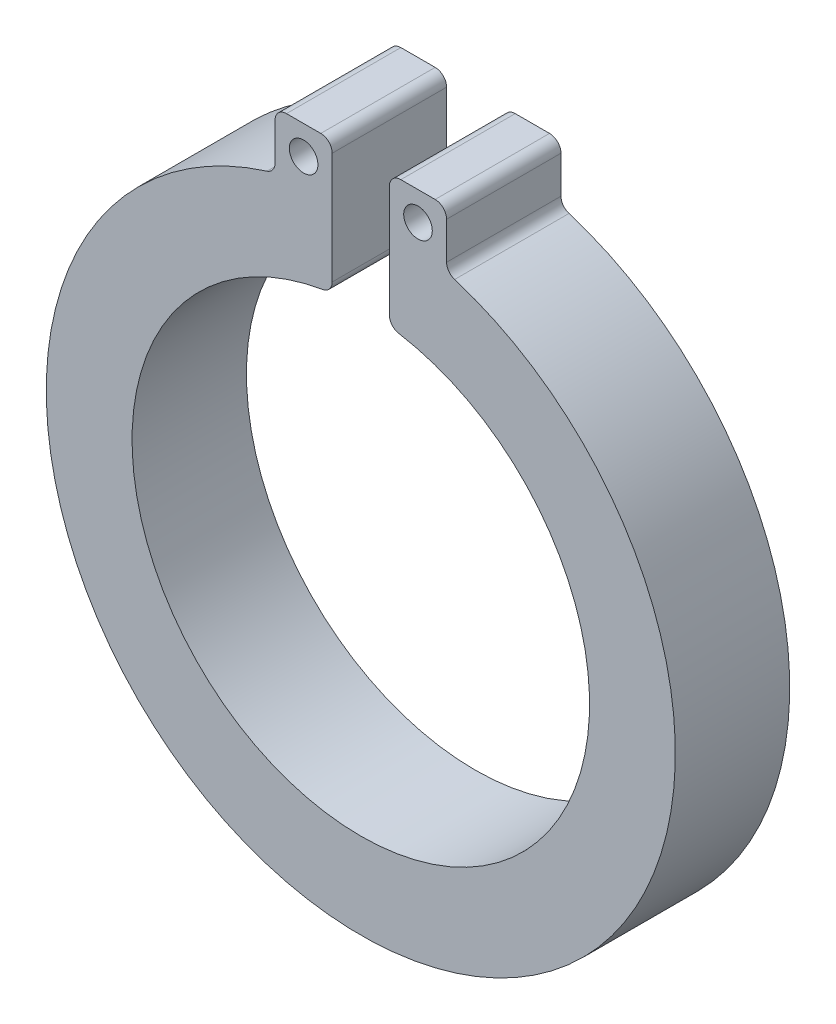
ISO-10303-21;
HEADER;
FILE_DESCRIPTION(('STEP AP214'),'2;1');
FILE_NAME('part.step','',(''),(''),'','','');
FILE_SCHEMA(('AUTOMOTIVE_DESIGN { 1 0 10303 214 1 1 1 1 }'));
ENDSEC;
DATA;
#1=APPLICATION_CONTEXT('core data for automotive mechanical design processes');
#2=APPLICATION_PROTOCOL_DEFINITION('international standard','automotive_design',2000,#1);
#3=PRODUCT_CONTEXT('',#1,'mechanical');
#4=PRODUCT('Part','Part','',(#3));
#5=PRODUCT_RELATED_PRODUCT_CATEGORY('part','',(#4));
#6=PRODUCT_DEFINITION_FORMATION('','',#4);
#7=PRODUCT_DEFINITION_CONTEXT('part definition',#1,'design');
#8=PRODUCT_DEFINITION('design','',#6,#7);
#9=PRODUCT_DEFINITION_SHAPE('','',#8);
#10=(LENGTH_UNIT() NAMED_UNIT(*) SI_UNIT(.MILLI.,.METRE.));
#11=(NAMED_UNIT(*) PLANE_ANGLE_UNIT() SI_UNIT($,.RADIAN.));
#12=(NAMED_UNIT(*) SI_UNIT($,.STERADIAN.) SOLID_ANGLE_UNIT());
#13=UNCERTAINTY_MEASURE_WITH_UNIT(LENGTH_MEASURE(1.E-05),#10,'distance_accuracy_value','');
#14=(GEOMETRIC_REPRESENTATION_CONTEXT(3) GLOBAL_UNCERTAINTY_ASSIGNED_CONTEXT((#13)) GLOBAL_UNIT_ASSIGNED_CONTEXT((#10,
#11,#12)) REPRESENTATION_CONTEXT('',''));
#15=CARTESIAN_POINT('',(0.,0.,0.));
#16=DIRECTION('',(0.,0.,1.));
#17=DIRECTION('',(1.,0.,0.));
#18=AXIS2_PLACEMENT_3D('',#15,#16,#17);
#19=CARTESIAN_POINT('',(0.,0.,1.));
#20=DIRECTION('',(0.,0.,1.));
#21=DIRECTION('',(1.,0.,0.));
#22=AXIS2_PLACEMENT_3D('',#19,#20,#21);
#23=PLANE('',#22);
#24=CARTESIAN_POINT('',(-0.5,2.89575131106459,1.));
#25=DIRECTION('',(0.,0.,1.));
#26=DIRECTION('',(1.,0.,0.));
#27=AXIS2_PLACEMENT_3D('',#24,#25,#26);
#28=CIRCLE('',#27,0.125);
#29=CARTESIAN_POINT('',(-0.375,2.89575131106459,1.));
#30=VERTEX_POINT('',#29);
#31=EDGE_CURVE('E186',#30,#30,#28,.T.);
#32=ORIENTED_EDGE('',*,*,#31,.F.);
#33=EDGE_LOOP('',(#32));
#34=FACE_BOUND('',#33,.T.);
#35=DIRECTION('',(-1.,0.,0.));
#36=VECTOR('',#35,1.);
#37=CARTESIAN_POINT('',(-0.25,3.14575131106459,1.));
#38=LINE('',#37,#36);
#39=CARTESIAN_POINT('',(-0.35,3.14575131106459,1.));
#40=VERTEX_POINT('',#39);
#41=CARTESIAN_POINT('',(-0.65,3.14575131106459,1.));
#42=VERTEX_POINT('',#41);
#43=EDGE_CURVE('E203',#40,#42,#38,.T.);
#44=ORIENTED_EDGE('',*,*,#43,.T.);
#45=CARTESIAN_POINT('',(-0.65,3.04575131106459,1.));
#46=DIRECTION('',(0.,0.,1.));
#47=DIRECTION('',(1.,0.,0.));
#48=AXIS2_PLACEMENT_3D('',#45,#46,#47);
#49=CIRCLE('',#48,0.1);
#50=CARTESIAN_POINT('',(-0.75,3.04575131106459,1.));
#51=VERTEX_POINT('',#50);
#52=EDGE_CURVE('E226',#42,#51,#49,.T.);
#53=ORIENTED_EDGE('',*,*,#52,.T.);
#54=DIRECTION('',(0.,-1.,0.));
#55=VECTOR('',#54,1.);
#56=CARTESIAN_POINT('',(-0.75,3.14575131106459,1.));
#57=LINE('',#56,#55);
#58=CARTESIAN_POINT('',(-0.75,2.72029410174709,1.));
#59=VERTEX_POINT('',#58);
#60=EDGE_CURVE('E173',#51,#59,#57,.T.);
#61=ORIENTED_EDGE('',*,*,#60,.T.);
#62=CARTESIAN_POINT('',(-0.85,2.72029410174709,1.));
#63=DIRECTION('',(0.,0.,1.));
#64=DIRECTION('',(1.,0.,0.));
#65=AXIS2_PLACEMENT_3D('',#62,#63,#64);
#66=CIRCLE('',#65,0.1);
#67=CARTESIAN_POINT('',(-0.820175438596491,2.62484518589631,1.));
#68=VERTEX_POINT('',#67);
#69=EDGE_CURVE('E11',#59,#68,#66,.F.);
#70=ORIENTED_EDGE('',*,*,#69,.T.);
#71=CARTESIAN_POINT('',(0.,0.,1.));
#72=DIRECTION('',(0.,0.,1.));
#73=DIRECTION('',(1.,0.,0.));
#74=AXIS2_PLACEMENT_3D('',#71,#72,#73);
#75=CIRCLE('',#74,2.75);
#76=CARTESIAN_POINT('',(0.820175438596491,2.62484518589631,1.));
#77=VERTEX_POINT('',#76);
#78=EDGE_CURVE('E269',#68,#77,#75,.T.);
#79=ORIENTED_EDGE('',*,*,#78,.T.);
#80=CARTESIAN_POINT('',(0.85,2.72029410174709,1.));
#81=DIRECTION('',(0.,0.,1.));
#82=DIRECTION('',(1.,0.,0.));
#83=AXIS2_PLACEMENT_3D('',#80,#81,#82);
#84=CIRCLE('',#83,0.1);
#85=CARTESIAN_POINT('',(0.75,2.72029410174709,1.));
#86=VERTEX_POINT('',#85);
#87=EDGE_CURVE('E259',#77,#86,#84,.F.);
#88=ORIENTED_EDGE('',*,*,#87,.T.);
#89=DIRECTION('',(0.,1.,0.));
#90=VECTOR('',#89,1.);
#91=CARTESIAN_POINT('',(0.75,3.14575131106459,1.));
#92=LINE('',#91,#90);
#93=CARTESIAN_POINT('',(0.75,3.04575131106459,1.));
#94=VERTEX_POINT('',#93);
#95=EDGE_CURVE('E266',#86,#94,#92,.T.);
#96=ORIENTED_EDGE('',*,*,#95,.T.);
#97=CARTESIAN_POINT('',(0.65,3.04575131106459,1.));
#98=DIRECTION('',(0.,0.,1.));
#99=DIRECTION('',(1.,0.,0.));
#100=AXIS2_PLACEMENT_3D('',#97,#98,#99);
#101=CIRCLE('',#100,0.1);
#102=CARTESIAN_POINT('',(0.65,3.14575131106459,1.));
#103=VERTEX_POINT('',#102);
#104=EDGE_CURVE('E220',#94,#103,#101,.T.);
#105=ORIENTED_EDGE('',*,*,#104,.T.);
#106=DIRECTION('',(-1.,0.,0.));
#107=VECTOR('',#106,1.);
#108=CARTESIAN_POINT('',(0.25,3.14575131106459,1.));
#109=LINE('',#108,#107);
#110=CARTESIAN_POINT('',(0.35,3.14575131106459,1.));
#111=VERTEX_POINT('',#110);
#112=EDGE_CURVE('E277',#103,#111,#109,.T.);
#113=ORIENTED_EDGE('',*,*,#112,.T.);
#114=CARTESIAN_POINT('',(0.35,3.04575131106459,1.));
#115=DIRECTION('',(0.,0.,1.));
#116=DIRECTION('',(1.,0.,0.));
#117=AXIS2_PLACEMENT_3D('',#114,#115,#116);
#118=CIRCLE('',#117,0.1);
#119=CARTESIAN_POINT('',(0.25,3.04575131106459,1.));
#120=VERTEX_POINT('',#119);
#121=EDGE_CURVE('E222',#111,#120,#118,.T.);
#122=ORIENTED_EDGE('',*,*,#121,.T.);
#123=DIRECTION('',(0.,-1.,0.));
#124=VECTOR('',#123,1.);
#125=CARTESIAN_POINT('',(0.25,3.14575131106459,1.));
#126=LINE('',#125,#124);
#127=CARTESIAN_POINT('',(0.25,2.07062792408487,1.));
#128=VERTEX_POINT('',#127);
#129=EDGE_CURVE('E293',#120,#128,#126,.T.);
#130=ORIENTED_EDGE('',*,*,#129,.T.);
#131=CARTESIAN_POINT('',(0.35,2.07062792408487,1.));
#132=DIRECTION('',(0.,0.,1.));
#133=DIRECTION('',(1.,0.,0.));
#134=AXIS2_PLACEMENT_3D('',#131,#132,#133);
#135=CIRCLE('',#134,0.1);
#136=CARTESIAN_POINT('',(0.333333333333333,1.97202659436654,1.));
#137=VERTEX_POINT('',#136);
#138=EDGE_CURVE('E218',#128,#137,#135,.T.);
#139=ORIENTED_EDGE('',*,*,#138,.T.);
#140=CARTESIAN_POINT('',(0.,0.,1.));
#141=DIRECTION('',(0.,0.,-1.));
#142=DIRECTION('',(1.,0.,0.));
#143=AXIS2_PLACEMENT_3D('',#140,#141,#142);
#144=CIRCLE('',#143,2.);
#145=CARTESIAN_POINT('',(-0.333333333333333,1.97202659436654,1.));
#146=VERTEX_POINT('',#145);
#147=EDGE_CURVE('E296',#137,#146,#144,.T.);
#148=ORIENTED_EDGE('',*,*,#147,.T.);
#149=CARTESIAN_POINT('',(-0.35,2.07062792408487,1.));
#150=DIRECTION('',(0.,0.,1.));
#151=DIRECTION('',(1.,0.,0.));
#152=AXIS2_PLACEMENT_3D('',#149,#150,#151);
#153=CIRCLE('',#152,0.1);
#154=CARTESIAN_POINT('',(-0.25,2.07062792408487,1.));
#155=VERTEX_POINT('',#154);
#156=EDGE_CURVE('E61',#146,#155,#153,.T.);
#157=ORIENTED_EDGE('',*,*,#156,.T.);
#158=DIRECTION('',(0.,1.,0.));
#159=VECTOR('',#158,1.);
#160=CARTESIAN_POINT('',(-0.25,3.14575131106459,1.));
#161=LINE('',#160,#159);
#162=CARTESIAN_POINT('',(-0.25,3.04575131106459,1.));
#163=VERTEX_POINT('',#162);
#164=EDGE_CURVE('E204',#155,#163,#161,.T.);
#165=ORIENTED_EDGE('',*,*,#164,.T.);
#166=CARTESIAN_POINT('',(-0.35,3.04575131106459,1.));
#167=DIRECTION('',(0.,0.,1.));
#168=DIRECTION('',(1.,0.,0.));
#169=AXIS2_PLACEMENT_3D('',#166,#167,#168);
#170=CIRCLE('',#169,0.1);
#171=EDGE_CURVE('E224',#163,#40,#170,.T.);
#172=ORIENTED_EDGE('',*,*,#171,.T.);
#173=EDGE_LOOP('',(#44,#53,#61,#70,#79,#88,#96,#105,#113,#122,#130,#139,#148,#157,#165,#172));
#174=FACE_BOUND('',#173,.T.);
#175=CARTESIAN_POINT('',(0.5,2.89575131106459,1.));
#176=DIRECTION('',(0.,0.,1.));
#177=DIRECTION('',(1.,0.,0.));
#178=AXIS2_PLACEMENT_3D('',#175,#176,#177);
#179=CIRCLE('',#178,0.125);
#180=CARTESIAN_POINT('',(0.625,2.89575131106459,1.));
#181=VERTEX_POINT('',#180);
#182=EDGE_CURVE('E503',#181,#181,#179,.T.);
#183=ORIENTED_EDGE('',*,*,#182,.F.);
#184=EDGE_LOOP('',(#183));
#185=FACE_BOUND('',#184,.T.);
#186=ADVANCED_FACE('F39',(#34,#174,#185),#23,.T.);
#187=CARTESIAN_POINT('',(0.,0.,0.));
#188=DIRECTION('',(0.,0.,1.));
#189=DIRECTION('',(1.,0.,0.));
#190=AXIS2_PLACEMENT_3D('',#187,#188,#189);
#191=PLANE('',#190);
#192=DIRECTION('',(0.,-1.,0.));
#193=VECTOR('',#192,1.);
#194=CARTESIAN_POINT('',(-0.75,3.14575131106459,0.));
#195=LINE('',#194,#193);
#196=CARTESIAN_POINT('',(-0.75,3.04575131106459,0.));
#197=VERTEX_POINT('',#196);
#198=CARTESIAN_POINT('',(-0.75,2.72029410174709,0.));
#199=VERTEX_POINT('',#198);
#200=EDGE_CURVE('E170',#197,#199,#195,.T.);
#201=ORIENTED_EDGE('',*,*,#200,.F.);
#202=CARTESIAN_POINT('',(-0.65,3.04575131106459,0.));
#203=DIRECTION('',(0.,0.,1.));
#204=DIRECTION('',(1.,0.,0.));
#205=AXIS2_PLACEMENT_3D('',#202,#203,#204);
#206=CIRCLE('',#205,0.1);
#207=CARTESIAN_POINT('',(-0.65,3.14575131106459,0.));
#208=VERTEX_POINT('',#207);
#209=EDGE_CURVE('E153',#197,#208,#206,.F.);
#210=ORIENTED_EDGE('',*,*,#209,.T.);
#211=DIRECTION('',(-1.,0.,0.));
#212=VECTOR('',#211,1.);
#213=CARTESIAN_POINT('',(-0.25,3.14575131106459,0.));
#214=LINE('',#213,#212);
#215=CARTESIAN_POINT('',(-0.35,3.14575131106459,0.));
#216=VERTEX_POINT('',#215);
#217=EDGE_CURVE('E181',#216,#208,#214,.T.);
#218=ORIENTED_EDGE('',*,*,#217,.F.);
#219=CARTESIAN_POINT('',(-0.35,3.04575131106459,0.));
#220=DIRECTION('',(0.,0.,1.));
#221=DIRECTION('',(1.,0.,0.));
#222=AXIS2_PLACEMENT_3D('',#219,#220,#221);
#223=CIRCLE('',#222,0.1);
#224=CARTESIAN_POINT('',(-0.25,3.04575131106459,0.));
#225=VERTEX_POINT('',#224);
#226=EDGE_CURVE('E164',#216,#225,#223,.F.);
#227=ORIENTED_EDGE('',*,*,#226,.T.);
#228=DIRECTION('',(0.,1.,0.));
#229=VECTOR('',#228,1.);
#230=CARTESIAN_POINT('',(-0.25,3.14575131106459,0.));
#231=LINE('',#230,#229);
#232=CARTESIAN_POINT('',(-0.25,2.07062792408487,0.));
#233=VERTEX_POINT('',#232);
#234=EDGE_CURVE('E201',#233,#225,#231,.T.);
#235=ORIENTED_EDGE('',*,*,#234,.F.);
#236=CARTESIAN_POINT('',(-0.35,2.07062792408487,0.));
#237=DIRECTION('',(0.,0.,1.));
#238=DIRECTION('',(1.,0.,0.));
#239=AXIS2_PLACEMENT_3D('',#236,#237,#238);
#240=CIRCLE('',#239,0.1);
#241=CARTESIAN_POINT('',(-0.333333333333333,1.97202659436654,0.));
#242=VERTEX_POINT('',#241);
#243=EDGE_CURVE('E174',#233,#242,#240,.F.);
#244=ORIENTED_EDGE('',*,*,#243,.T.);
#245=CARTESIAN_POINT('',(0.,0.,0.));
#246=DIRECTION('',(0.,0.,-1.));
#247=DIRECTION('',(1.,0.,0.));
#248=AXIS2_PLACEMENT_3D('',#245,#246,#247);
#249=CIRCLE('',#248,2.);
#250=CARTESIAN_POINT('',(0.333333333333333,1.97202659436654,0.));
#251=VERTEX_POINT('',#250);
#252=EDGE_CURVE('E198',#251,#242,#249,.T.);
#253=ORIENTED_EDGE('',*,*,#252,.F.);
#254=CARTESIAN_POINT('',(0.35,2.07062792408487,0.));
#255=DIRECTION('',(0.,0.,1.));
#256=DIRECTION('',(1.,0.,0.));
#257=AXIS2_PLACEMENT_3D('',#254,#255,#256);
#258=CIRCLE('',#257,0.1);
#259=CARTESIAN_POINT('',(0.25,2.07062792408487,0.));
#260=VERTEX_POINT('',#259);
#261=EDGE_CURVE('E207',#251,#260,#258,.F.);
#262=ORIENTED_EDGE('',*,*,#261,.T.);
#263=DIRECTION('',(0.,-1.,0.));
#264=VECTOR('',#263,1.);
#265=CARTESIAN_POINT('',(0.25,3.14575131106459,0.));
#266=LINE('',#265,#264);
#267=CARTESIAN_POINT('',(0.25,3.04575131106459,0.));
#268=VERTEX_POINT('',#267);
#269=EDGE_CURVE('E195',#268,#260,#266,.T.);
#270=ORIENTED_EDGE('',*,*,#269,.F.);
#271=CARTESIAN_POINT('',(0.35,3.04575131106459,0.));
#272=DIRECTION('',(0.,0.,1.));
#273=DIRECTION('',(1.,0.,0.));
#274=AXIS2_PLACEMENT_3D('',#271,#272,#273);
#275=CIRCLE('',#274,0.1);
#276=CARTESIAN_POINT('',(0.35,3.14575131106459,0.));
#277=VERTEX_POINT('',#276);
#278=EDGE_CURVE('E211',#268,#277,#275,.F.);
#279=ORIENTED_EDGE('',*,*,#278,.T.);
#280=DIRECTION('',(-1.,0.,0.));
#281=VECTOR('',#280,1.);
#282=CARTESIAN_POINT('',(0.25,3.14575131106459,0.));
#283=LINE('',#282,#281);
#284=CARTESIAN_POINT('',(0.65,3.14575131106459,0.));
#285=VERTEX_POINT('',#284);
#286=EDGE_CURVE('E192',#285,#277,#283,.T.);
#287=ORIENTED_EDGE('',*,*,#286,.F.);
#288=CARTESIAN_POINT('',(0.65,3.04575131106459,0.));
#289=DIRECTION('',(0.,0.,1.));
#290=DIRECTION('',(1.,0.,0.));
#291=AXIS2_PLACEMENT_3D('',#288,#289,#290);
#292=CIRCLE('',#291,0.1);
#293=CARTESIAN_POINT('',(0.75,3.04575131106459,0.));
#294=VERTEX_POINT('',#293);
#295=EDGE_CURVE('E209',#285,#294,#292,.F.);
#296=ORIENTED_EDGE('',*,*,#295,.T.);
#297=DIRECTION('',(0.,1.,0.));
#298=VECTOR('',#297,1.);
#299=CARTESIAN_POINT('',(0.75,3.14575131106459,0.));
#300=LINE('',#299,#298);
#301=CARTESIAN_POINT('',(0.75,2.72029410174709,0.));
#302=VERTEX_POINT('',#301);
#303=EDGE_CURVE('E184',#302,#294,#300,.T.);
#304=ORIENTED_EDGE('',*,*,#303,.F.);
#305=CARTESIAN_POINT('',(0.85,2.72029410174709,0.));
#306=DIRECTION('',(0.,0.,1.));
#307=DIRECTION('',(1.,0.,0.));
#308=AXIS2_PLACEMENT_3D('',#305,#306,#307);
#309=CIRCLE('',#308,0.1);
#310=CARTESIAN_POINT('',(0.820175438596491,2.62484518589631,0.));
#311=VERTEX_POINT('',#310);
#312=EDGE_CURVE('E257',#302,#311,#309,.T.);
#313=ORIENTED_EDGE('',*,*,#312,.T.);
#314=CARTESIAN_POINT('',(0.,0.,0.));
#315=DIRECTION('',(0.,0.,1.));
#316=DIRECTION('',(1.,0.,0.));
#317=AXIS2_PLACEMENT_3D('',#314,#315,#316);
#318=CIRCLE('',#317,2.75);
#319=CARTESIAN_POINT('',(-0.820175438596491,2.62484518589631,0.));
#320=VERTEX_POINT('',#319);
#321=EDGE_CURVE('E180',#320,#311,#318,.T.);
#322=ORIENTED_EDGE('',*,*,#321,.F.);
#323=CARTESIAN_POINT('',(-0.85,2.72029410174709,0.));
#324=DIRECTION('',(0.,0.,1.));
#325=DIRECTION('',(1.,0.,0.));
#326=AXIS2_PLACEMENT_3D('',#323,#324,#325);
#327=CIRCLE('',#326,0.1);
#328=EDGE_CURVE('E47',#320,#199,#327,.T.);
#329=ORIENTED_EDGE('',*,*,#328,.T.);
#330=EDGE_LOOP('',(#201,#210,#218,#227,#235,#244,#253,#262,#270,#279,#287,#296,#304,#313,#322,#329));
#331=FACE_BOUND('',#330,.T.);
#332=CARTESIAN_POINT('',(-0.5,2.89575131106459,0.));
#333=DIRECTION('',(0.,0.,1.));
#334=DIRECTION('',(1.,0.,0.));
#335=AXIS2_PLACEMENT_3D('',#332,#333,#334);
#336=CIRCLE('',#335,0.125);
#337=CARTESIAN_POINT('',(-0.375,2.89575131106459,0.));
#338=VERTEX_POINT('',#337);
#339=EDGE_CURVE('E502',#338,#338,#336,.T.);
#340=ORIENTED_EDGE('',*,*,#339,.T.);
#341=EDGE_LOOP('',(#340));
#342=FACE_BOUND('',#341,.T.);
#343=CARTESIAN_POINT('',(0.5,2.89575131106459,0.));
#344=DIRECTION('',(0.,0.,1.));
#345=DIRECTION('',(1.,0.,0.));
#346=AXIS2_PLACEMENT_3D('',#343,#344,#345);
#347=CIRCLE('',#346,0.125);
#348=CARTESIAN_POINT('',(0.625,2.89575131106459,0.));
#349=VERTEX_POINT('',#348);
#350=EDGE_CURVE('E506',#349,#349,#347,.T.);
#351=ORIENTED_EDGE('',*,*,#350,.T.);
#352=EDGE_LOOP('',(#351));
#353=FACE_BOUND('',#352,.T.);
#354=ADVANCED_FACE('F177',(#331,#342,#353),#191,.F.);
#355=CARTESIAN_POINT('',(-0.25,3.14575131106459,1.));
#356=DIRECTION('',(0.,-1.,0.));
#357=DIRECTION('',(0.,0.,-1.));
#358=AXIS2_PLACEMENT_3D('',#355,#356,#357);
#359=PLANE('',#358);
#360=ORIENTED_EDGE('',*,*,#217,.T.);
#361=DIRECTION('',(0.,0.,-1.));
#362=VECTOR('',#361,1.);
#363=CARTESIAN_POINT('',(-0.65,3.14575131106459,1.));
#364=LINE('',#363,#362);
#365=EDGE_CURVE('E158',#208,#42,#364,.F.);
#366=ORIENTED_EDGE('',*,*,#365,.T.);
#367=ORIENTED_EDGE('',*,*,#43,.F.);
#368=DIRECTION('',(0.,0.,-1.));
#369=VECTOR('',#368,1.);
#370=CARTESIAN_POINT('',(-0.35,3.14575131106459,1.));
#371=LINE('',#370,#369);
#372=EDGE_CURVE('E163',#40,#216,#371,.T.);
#373=ORIENTED_EDGE('',*,*,#372,.T.);
#374=EDGE_LOOP('',(#360,#366,#367,#373));
#375=FACE_BOUND('',#374,.T.);
#376=ADVANCED_FACE('F304',(#375),#359,.F.);
#377=CARTESIAN_POINT('',(-0.75,3.14575131106459,1.));
#378=DIRECTION('',(1.,0.,0.));
#379=DIRECTION('',(0.,1.,0.));
#380=AXIS2_PLACEMENT_3D('',#377,#378,#379);
#381=PLANE('',#380);
#382=ORIENTED_EDGE('',*,*,#60,.F.);
#383=DIRECTION('',(0.,0.,-1.));
#384=VECTOR('',#383,1.);
#385=CARTESIAN_POINT('',(-0.75,3.04575131106459,1.));
#386=LINE('',#385,#384);
#387=EDGE_CURVE('E157',#51,#197,#386,.T.);
#388=ORIENTED_EDGE('',*,*,#387,.T.);
#389=ORIENTED_EDGE('',*,*,#200,.T.);
#390=DIRECTION('',(0.,0.,1.));
#391=VECTOR('',#390,1.);
#392=CARTESIAN_POINT('',(-0.75,2.72029410174709,1.));
#393=LINE('',#392,#391);
#394=EDGE_CURVE('E175',#199,#59,#393,.T.);
#395=ORIENTED_EDGE('',*,*,#394,.T.);
#396=EDGE_LOOP('',(#382,#388,#389,#395));
#397=FACE_BOUND('',#396,.T.);
#398=ADVANCED_FACE('F169',(#397),#381,.F.);
#399=CARTESIAN_POINT('',(0.,0.,1.));
#400=DIRECTION('',(0.,0.,-1.));
#401=DIRECTION('',(-1.,0.,0.));
#402=AXIS2_PLACEMENT_3D('',#399,#400,#401);
#403=CYLINDRICAL_SURFACE('',#402,2.75);
#404=ORIENTED_EDGE('',*,*,#321,.T.);
#405=DIRECTION('',(0.,0.,-1.));
#406=VECTOR('',#405,1.);
#407=CARTESIAN_POINT('',(0.820175438596491,2.62484518589631,1.));
#408=LINE('',#407,#406);
#409=EDGE_CURVE('E250',#311,#77,#408,.F.);
#410=ORIENTED_EDGE('',*,*,#409,.T.);
#411=ORIENTED_EDGE('',*,*,#78,.F.);
#412=DIRECTION('',(0.,0.,-1.));
#413=VECTOR('',#412,1.);
#414=CARTESIAN_POINT('',(-0.820175438596491,2.62484518589631,1.));
#415=LINE('',#414,#413);
#416=EDGE_CURVE('E247',#68,#320,#415,.T.);
#417=ORIENTED_EDGE('',*,*,#416,.T.);
#418=EDGE_LOOP('',(#404,#410,#411,#417));
#419=FACE_BOUND('',#418,.T.);
#420=ADVANCED_FACE('F281',(#419),#403,.T.);
#421=CARTESIAN_POINT('',(0.75,3.14575131106459,1.));
#422=DIRECTION('',(-1.,0.,0.));
#423=DIRECTION('',(0.,-1.,0.));
#424=AXIS2_PLACEMENT_3D('',#421,#422,#423);
#425=PLANE('',#424);
#426=ORIENTED_EDGE('',*,*,#303,.T.);
#427=DIRECTION('',(0.,0.,-1.));
#428=VECTOR('',#427,1.);
#429=CARTESIAN_POINT('',(0.75,3.04575131106459,1.));
#430=LINE('',#429,#428);
#431=EDGE_CURVE('E245',#294,#94,#430,.F.);
#432=ORIENTED_EDGE('',*,*,#431,.T.);
#433=ORIENTED_EDGE('',*,*,#95,.F.);
#434=DIRECTION('',(0.,0.,1.));
#435=VECTOR('',#434,1.);
#436=CARTESIAN_POINT('',(0.75,2.72029410174709,0.));
#437=LINE('',#436,#435);
#438=EDGE_CURVE('E242',#86,#302,#437,.F.);
#439=ORIENTED_EDGE('',*,*,#438,.T.);
#440=EDGE_LOOP('',(#426,#432,#433,#439));
#441=FACE_BOUND('',#440,.T.);
#442=ADVANCED_FACE('F274',(#441),#425,.F.);
#443=CARTESIAN_POINT('',(0.25,3.14575131106459,1.));
#444=DIRECTION('',(0.,-1.,0.));
#445=DIRECTION('',(0.,0.,-1.));
#446=AXIS2_PLACEMENT_3D('',#443,#444,#445);
#447=PLANE('',#446);
#448=ORIENTED_EDGE('',*,*,#286,.T.);
#449=DIRECTION('',(0.,0.,-1.));
#450=VECTOR('',#449,1.);
#451=CARTESIAN_POINT('',(0.35,3.14575131106459,1.));
#452=LINE('',#451,#450);
#453=EDGE_CURVE('E240',#277,#111,#452,.F.);
#454=ORIENTED_EDGE('',*,*,#453,.T.);
#455=ORIENTED_EDGE('',*,*,#112,.F.);
#456=DIRECTION('',(0.,0.,-1.));
#457=VECTOR('',#456,1.);
#458=CARTESIAN_POINT('',(0.65,3.14575131106459,1.));
#459=LINE('',#458,#457);
#460=EDGE_CURVE('E237',#103,#285,#459,.T.);
#461=ORIENTED_EDGE('',*,*,#460,.T.);
#462=EDGE_LOOP('',(#448,#454,#455,#461));
#463=FACE_BOUND('',#462,.T.);
#464=ADVANCED_FACE('F329',(#463),#447,.F.);
#465=CARTESIAN_POINT('',(0.25,3.14575131106459,1.));
#466=DIRECTION('',(1.,0.,0.));
#467=DIRECTION('',(0.,1.,0.));
#468=AXIS2_PLACEMENT_3D('',#465,#466,#467);
#469=PLANE('',#468);
#470=ORIENTED_EDGE('',*,*,#129,.F.);
#471=DIRECTION('',(0.,0.,-1.));
#472=VECTOR('',#471,1.);
#473=CARTESIAN_POINT('',(0.25,3.04575131106459,1.));
#474=LINE('',#473,#472);
#475=EDGE_CURVE('E234',#120,#268,#474,.T.);
#476=ORIENTED_EDGE('',*,*,#475,.T.);
#477=ORIENTED_EDGE('',*,*,#269,.T.);
#478=DIRECTION('',(0.,0.,-1.));
#479=VECTOR('',#478,1.);
#480=CARTESIAN_POINT('',(0.25,2.07062792408487,1.));
#481=LINE('',#480,#479);
#482=EDGE_CURVE('E232',#260,#128,#481,.F.);
#483=ORIENTED_EDGE('',*,*,#482,.T.);
#484=EDGE_LOOP('',(#470,#476,#477,#483));
#485=FACE_BOUND('',#484,.T.);
#486=ADVANCED_FACE('F321',(#485),#469,.F.);
#487=CARTESIAN_POINT('',(0.,0.,1.));
#488=DIRECTION('',(0.,0.,-1.));
#489=DIRECTION('',(-1.,0.,0.));
#490=AXIS2_PLACEMENT_3D('',#487,#488,#489);
#491=CYLINDRICAL_SURFACE('',#490,2.);
#492=ORIENTED_EDGE('',*,*,#147,.F.);
#493=DIRECTION('',(0.,0.,-1.));
#494=VECTOR('',#493,1.);
#495=CARTESIAN_POINT('',(0.333333333333333,1.97202659436654,1.));
#496=LINE('',#495,#494);
#497=EDGE_CURVE('E254',#137,#251,#496,.T.);
#498=ORIENTED_EDGE('',*,*,#497,.T.);
#499=ORIENTED_EDGE('',*,*,#252,.T.);
#500=DIRECTION('',(0.,0.,-1.));
#501=VECTOR('',#500,1.);
#502=CARTESIAN_POINT('',(-0.333333333333333,1.97202659436654,1.));
#503=LINE('',#502,#501);
#504=EDGE_CURVE('E252',#242,#146,#503,.F.);
#505=ORIENTED_EDGE('',*,*,#504,.T.);
#506=EDGE_LOOP('',(#492,#498,#499,#505));
#507=FACE_BOUND('',#506,.T.);
#508=ADVANCED_FACE('F312',(#507),#491,.F.);
#509=CARTESIAN_POINT('',(-0.25,3.14575131106459,1.));
#510=DIRECTION('',(-1.,0.,0.));
#511=DIRECTION('',(0.,-1.,0.));
#512=AXIS2_PLACEMENT_3D('',#509,#510,#511);
#513=PLANE('',#512);
#514=ORIENTED_EDGE('',*,*,#234,.T.);
#515=DIRECTION('',(0.,0.,-1.));
#516=VECTOR('',#515,1.);
#517=CARTESIAN_POINT('',(-0.25,3.04575131106459,1.));
#518=LINE('',#517,#516);
#519=EDGE_CURVE('E54',#225,#163,#518,.F.);
#520=ORIENTED_EDGE('',*,*,#519,.T.);
#521=ORIENTED_EDGE('',*,*,#164,.F.);
#522=DIRECTION('',(0.,0.,-1.));
#523=VECTOR('',#522,1.);
#524=CARTESIAN_POINT('',(-0.25,2.07062792408487,1.));
#525=LINE('',#524,#523);
#526=EDGE_CURVE('E228',#155,#233,#525,.T.);
#527=ORIENTED_EDGE('',*,*,#526,.T.);
#528=EDGE_LOOP('',(#514,#520,#521,#527));
#529=FACE_BOUND('',#528,.T.);
#530=ADVANCED_FACE('F306',(#529),#513,.F.);
#531=CARTESIAN_POINT('',(-0.5,2.89575131106459,1.));
#532=DIRECTION('',(0.,0.,-1.));
#533=DIRECTION('',(-1.,0.,0.));
#534=AXIS2_PLACEMENT_3D('',#531,#532,#533);
#535=CYLINDRICAL_SURFACE('',#534,0.125);
#536=ORIENTED_EDGE('',*,*,#31,.T.);
#537=EDGE_LOOP('',(#536));
#538=FACE_BOUND('',#537,.T.);
#539=ORIENTED_EDGE('',*,*,#339,.F.);
#540=EDGE_LOOP('',(#539));
#541=FACE_BOUND('',#540,.T.);
#542=ADVANCED_FACE('F352',(#538,#541),#535,.F.);
#543=CARTESIAN_POINT('',(0.5,2.89575131106459,1.));
#544=DIRECTION('',(0.,0.,-1.));
#545=DIRECTION('',(-1.,0.,0.));
#546=AXIS2_PLACEMENT_3D('',#543,#544,#545);
#547=CYLINDRICAL_SURFACE('',#546,0.125);
#548=ORIENTED_EDGE('',*,*,#182,.T.);
#549=EDGE_LOOP('',(#548));
#550=FACE_BOUND('',#549,.T.);
#551=ORIENTED_EDGE('',*,*,#350,.F.);
#552=EDGE_LOOP('',(#551));
#553=FACE_BOUND('',#552,.T.);
#554=ADVANCED_FACE('F373',(#550,#553),#547,.F.);
#555=CARTESIAN_POINT('',(-0.65,3.04575131106459,1.));
#556=DIRECTION('',(0.,0.,-1.));
#557=DIRECTION('',(-1.,0.,0.));
#558=AXIS2_PLACEMENT_3D('',#555,#556,#557);
#559=CYLINDRICAL_SURFACE('',#558,0.1);
#560=ORIENTED_EDGE('',*,*,#52,.F.);
#561=ORIENTED_EDGE('',*,*,#365,.F.);
#562=ORIENTED_EDGE('',*,*,#209,.F.);
#563=ORIENTED_EDGE('',*,*,#387,.F.);
#564=EDGE_LOOP('',(#560,#561,#562,#563));
#565=FACE_BOUND('',#564,.T.);
#566=ADVANCED_FACE('F156',(#565),#559,.T.);
#567=CARTESIAN_POINT('',(-0.35,3.04575131106459,1.));
#568=DIRECTION('',(0.,0.,-1.));
#569=DIRECTION('',(-1.,0.,0.));
#570=AXIS2_PLACEMENT_3D('',#567,#568,#569);
#571=CYLINDRICAL_SURFACE('',#570,0.1);
#572=ORIENTED_EDGE('',*,*,#171,.F.);
#573=ORIENTED_EDGE('',*,*,#519,.F.);
#574=ORIENTED_EDGE('',*,*,#226,.F.);
#575=ORIENTED_EDGE('',*,*,#372,.F.);
#576=EDGE_LOOP('',(#572,#573,#574,#575));
#577=FACE_BOUND('',#576,.T.);
#578=ADVANCED_FACE('F302',(#577),#571,.T.);
#579=CARTESIAN_POINT('',(0.35,3.04575131106459,1.));
#580=DIRECTION('',(0.,0.,-1.));
#581=DIRECTION('',(-1.,0.,0.));
#582=AXIS2_PLACEMENT_3D('',#579,#580,#581);
#583=CYLINDRICAL_SURFACE('',#582,0.1);
#584=ORIENTED_EDGE('',*,*,#121,.F.);
#585=ORIENTED_EDGE('',*,*,#453,.F.);
#586=ORIENTED_EDGE('',*,*,#278,.F.);
#587=ORIENTED_EDGE('',*,*,#475,.F.);
#588=EDGE_LOOP('',(#584,#585,#586,#587));
#589=FACE_BOUND('',#588,.T.);
#590=ADVANCED_FACE('F325',(#589),#583,.T.);
#591=CARTESIAN_POINT('',(0.65,3.04575131106459,1.));
#592=DIRECTION('',(0.,0.,-1.));
#593=DIRECTION('',(-1.,0.,0.));
#594=AXIS2_PLACEMENT_3D('',#591,#592,#593);
#595=CYLINDRICAL_SURFACE('',#594,0.1);
#596=ORIENTED_EDGE('',*,*,#104,.F.);
#597=ORIENTED_EDGE('',*,*,#431,.F.);
#598=ORIENTED_EDGE('',*,*,#295,.F.);
#599=ORIENTED_EDGE('',*,*,#460,.F.);
#600=EDGE_LOOP('',(#596,#597,#598,#599));
#601=FACE_BOUND('',#600,.T.);
#602=ADVANCED_FACE('F333',(#601),#595,.T.);
#603=CARTESIAN_POINT('',(0.85,2.72029410174709,1.));
#604=DIRECTION('',(0.,0.,-1.));
#605=DIRECTION('',(-1.,0.,0.));
#606=AXIS2_PLACEMENT_3D('',#603,#604,#605);
#607=CYLINDRICAL_SURFACE('',#606,0.1);
#608=ORIENTED_EDGE('',*,*,#87,.F.);
#609=ORIENTED_EDGE('',*,*,#409,.F.);
#610=ORIENTED_EDGE('',*,*,#312,.F.);
#611=ORIENTED_EDGE('',*,*,#438,.F.);
#612=EDGE_LOOP('',(#608,#609,#610,#611));
#613=FACE_BOUND('',#612,.T.);
#614=ADVANCED_FACE('F279',(#613),#607,.F.);
#615=CARTESIAN_POINT('',(-0.85,2.72029410174709,1.));
#616=DIRECTION('',(0.,0.,-1.));
#617=DIRECTION('',(-1.,0.,0.));
#618=AXIS2_PLACEMENT_3D('',#615,#616,#617);
#619=CYLINDRICAL_SURFACE('',#618,0.1);
#620=ORIENTED_EDGE('',*,*,#69,.F.);
#621=ORIENTED_EDGE('',*,*,#394,.F.);
#622=ORIENTED_EDGE('',*,*,#328,.F.);
#623=ORIENTED_EDGE('',*,*,#416,.F.);
#624=EDGE_LOOP('',(#620,#621,#622,#623));
#625=FACE_BOUND('',#624,.T.);
#626=ADVANCED_FACE('F285',(#625),#619,.F.);
#627=CARTESIAN_POINT('',(0.35,2.07062792408487,1.));
#628=DIRECTION('',(0.,0.,-1.));
#629=DIRECTION('',(-1.,0.,0.));
#630=AXIS2_PLACEMENT_3D('',#627,#628,#629);
#631=CYLINDRICAL_SURFACE('',#630,0.1);
#632=ORIENTED_EDGE('',*,*,#138,.F.);
#633=ORIENTED_EDGE('',*,*,#482,.F.);
#634=ORIENTED_EDGE('',*,*,#261,.F.);
#635=ORIENTED_EDGE('',*,*,#497,.F.);
#636=EDGE_LOOP('',(#632,#633,#634,#635));
#637=FACE_BOUND('',#636,.T.);
#638=ADVANCED_FACE('F316',(#637),#631,.T.);
#639=CARTESIAN_POINT('',(-0.35,2.07062792408487,1.));
#640=DIRECTION('',(0.,0.,-1.));
#641=DIRECTION('',(-1.,0.,0.));
#642=AXIS2_PLACEMENT_3D('',#639,#640,#641);
#643=CYLINDRICAL_SURFACE('',#642,0.1);
#644=ORIENTED_EDGE('',*,*,#156,.F.);
#645=ORIENTED_EDGE('',*,*,#504,.F.);
#646=ORIENTED_EDGE('',*,*,#243,.F.);
#647=ORIENTED_EDGE('',*,*,#526,.F.);
#648=EDGE_LOOP('',(#644,#645,#646,#647));
#649=FACE_BOUND('',#648,.T.);
#650=ADVANCED_FACE('F41',(#649),#643,.T.);
#651=CLOSED_SHELL('',(#186,#354,#376,#398,#420,#442,#464,#486,#508,#530,#542,#554,#566,#578,
#590,#602,#614,#626,#638,#650));
#652=MANIFOLD_SOLID_BREP('B2',#651);
#653=ADVANCED_BREP_SHAPE_REPRESENTATION('',(#18,#652),#14);
#654=SHAPE_DEFINITION_REPRESENTATION(#9,#653);
ENDSEC;
END-ISO-10303-21;
